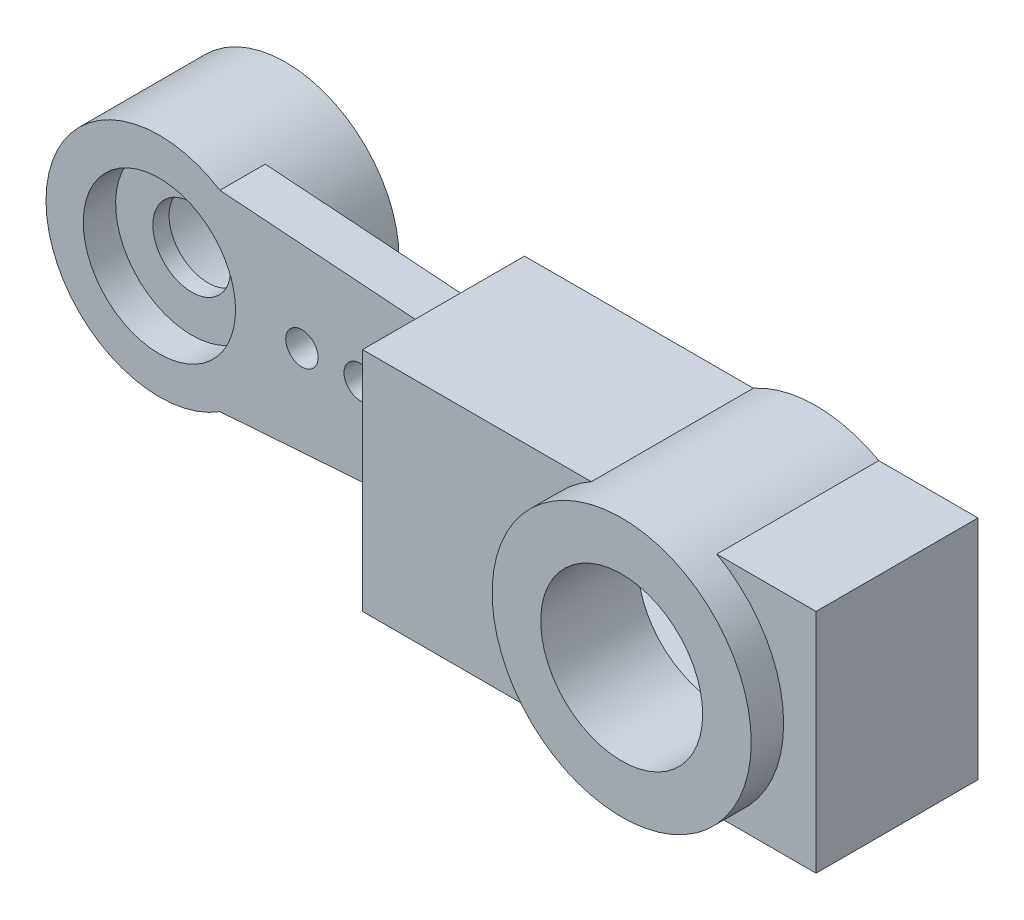
ISO-10303-21;
HEADER;
FILE_DESCRIPTION(('STEP AP214'),'2;1');
FILE_NAME('part.step','',(''),(''),'','','');
FILE_SCHEMA(('AUTOMOTIVE_DESIGN { 1 0 10303 214 1 1 1 1 }'));
ENDSEC;
DATA;
#1=APPLICATION_CONTEXT('core data for automotive mechanical design processes');
#2=APPLICATION_PROTOCOL_DEFINITION('international standard','automotive_design',2000,#1);
#3=PRODUCT_CONTEXT('',#1,'mechanical');
#4=PRODUCT('Part','Part','',(#3));
#5=PRODUCT_RELATED_PRODUCT_CATEGORY('part','',(#4));
#6=PRODUCT_DEFINITION_FORMATION('','',#4);
#7=PRODUCT_DEFINITION_CONTEXT('part definition',#1,'design');
#8=PRODUCT_DEFINITION('design','',#6,#7);
#9=PRODUCT_DEFINITION_SHAPE('','',#8);
#10=(LENGTH_UNIT() NAMED_UNIT(*) SI_UNIT(.MILLI.,.METRE.));
#11=(NAMED_UNIT(*) PLANE_ANGLE_UNIT() SI_UNIT($,.RADIAN.));
#12=(NAMED_UNIT(*) SI_UNIT($,.STERADIAN.) SOLID_ANGLE_UNIT());
#13=UNCERTAINTY_MEASURE_WITH_UNIT(LENGTH_MEASURE(1.E-05),#10,'distance_accuracy_value','');
#14=(GEOMETRIC_REPRESENTATION_CONTEXT(3) GLOBAL_UNCERTAINTY_ASSIGNED_CONTEXT((#13)) GLOBAL_UNIT_ASSIGNED_CONTEXT((#10,
#11,#12)) REPRESENTATION_CONTEXT('',''));
#15=CARTESIAN_POINT('',(0.,0.,0.));
#16=DIRECTION('',(0.,0.,1.));
#17=DIRECTION('',(1.,0.,0.));
#18=AXIS2_PLACEMENT_3D('',#15,#16,#17);
#19=CARTESIAN_POINT('',(13.5377556076663,7.66806747446083,7.8079032737814));
#20=DIRECTION('',(0.,0.,1.));
#21=DIRECTION('',(1.,0.,0.));
#22=AXIS2_PLACEMENT_3D('',#19,#20,#21);
#23=PLANE('',#22);
#24=DIRECTION('',(-1.,0.,0.));
#25=VECTOR('',#24,1.);
#26=CARTESIAN_POINT('',(13.5377556076663,5.16806747446083,7.8079032737814));
#27=LINE('',#26,#25);
#28=CARTESIAN_POINT('',(11.5377556076663,5.16806747446083,7.8079032737814));
#29=VERTEX_POINT('',#28);
#30=CARTESIAN_POINT('',(8.53775560766627,5.16806747446083,7.8079032737814));
#31=VERTEX_POINT('',#30);
#32=EDGE_CURVE('P0_E131',#29,#31,#27,.T.);
#33=ORIENTED_EDGE('',*,*,#32,.F.);
#34=DIRECTION('',(0.,1.,0.));
#35=VECTOR('',#34,1.);
#36=CARTESIAN_POINT('',(11.5377556076663,10.1680674744608,7.8079032737814));
#37=LINE('',#36,#35);
#38=CARTESIAN_POINT('',(11.5377556076663,10.1680674744608,7.8079032737814));
#39=VERTEX_POINT('',#38);
#40=EDGE_CURVE('P0_E130',#29,#39,#37,.T.);
#41=ORIENTED_EDGE('',*,*,#40,.T.);
#42=DIRECTION('',(-1.,0.,0.));
#43=VECTOR('',#42,1.);
#44=CARTESIAN_POINT('',(13.5377556076663,10.1680674744608,7.8079032737814));
#45=LINE('',#44,#43);
#46=CARTESIAN_POINT('',(8.53775560766627,10.1680674744608,7.8079032737814));
#47=VERTEX_POINT('',#46);
#48=EDGE_CURVE('P0_E117',#39,#47,#45,.T.);
#49=ORIENTED_EDGE('',*,*,#48,.T.);
#50=CARTESIAN_POINT('',(8.53775560766627,7.66806747446083,7.8079032737814));
#51=DIRECTION('',(0.,0.,-1.));
#52=DIRECTION('',(-1.,0.,0.));
#53=AXIS2_PLACEMENT_3D('',#50,#51,#52);
#54=CIRCLE('',#53,2.5);
#55=EDGE_CURVE('P0_E138',#31,#47,#54,.F.);
#56=ORIENTED_EDGE('',*,*,#55,.F.);
#57=EDGE_LOOP('',(#33,#41,#49,#56));
#58=FACE_BOUND('',#57,.T.);
#59=ADVANCED_FACE('P0_F17',(#58),#23,.T.);
#60=CARTESIAN_POINT('',(13.5377556076663,5.16806747446083,8.8079032737814));
#61=DIRECTION('',(0.,1.,0.));
#62=DIRECTION('',(0.,0.,1.));
#63=AXIS2_PLACEMENT_3D('',#60,#61,#62);
#64=PLANE('',#63);
#65=DIRECTION('',(-1.,0.,0.));
#66=VECTOR('',#65,1.);
#67=CARTESIAN_POINT('',(13.5377556076663,5.16806747446083,9.8079032737814));
#68=LINE('',#67,#66);
#69=CARTESIAN_POINT('',(11.5377556076663,5.16806747446083,9.8079032737814));
#70=VERTEX_POINT('',#69);
#71=CARTESIAN_POINT('',(8.53775560766627,5.16806747446083,9.8079032737814));
#72=VERTEX_POINT('',#71);
#73=EDGE_CURVE('P0_E218',#70,#72,#68,.T.);
#74=ORIENTED_EDGE('',*,*,#73,.F.);
#75=DIRECTION('',(0.,0.,-1.));
#76=VECTOR('',#75,1.);
#77=CARTESIAN_POINT('',(11.5377556076663,5.16806747446083,9.8079032737814));
#78=LINE('',#77,#76);
#79=EDGE_CURVE('P0_E31',#70,#29,#78,.T.);
#80=ORIENTED_EDGE('',*,*,#79,.T.);
#81=ORIENTED_EDGE('',*,*,#32,.T.);
#82=CARTESIAN_POINT('',(-0.46224439233373,5.16806747446083,7.8079032737814));
#83=VERTEX_POINT('',#82);
#84=EDGE_CURVE('P0_E220',#31,#83,#27,.T.);
#85=ORIENTED_EDGE('',*,*,#84,.T.);
#86=DIRECTION('',(0.,0.,-1.));
#87=VECTOR('',#86,1.);
#88=CARTESIAN_POINT('',(-0.46224439233373,5.16806747446083,8.8079032737814));
#89=LINE('',#88,#87);
#90=CARTESIAN_POINT('',(-0.46224439233373,5.16806747446083,9.8079032737814));
#91=VERTEX_POINT('',#90);
#92=EDGE_CURVE('P0_E179',#91,#83,#89,.T.);
#93=ORIENTED_EDGE('',*,*,#92,.F.);
#94=EDGE_CURVE('P0_E217',#72,#91,#68,.T.);
#95=ORIENTED_EDGE('',*,*,#94,.F.);
#96=EDGE_LOOP('',(#74,#80,#81,#85,#93,#95));
#97=FACE_BOUND('',#96,.T.);
#98=ADVANCED_FACE('P0_F275',(#97),#64,.T.);
#99=CARTESIAN_POINT('',(13.5377556076663,7.66806747446083,9.8079032737814));
#100=DIRECTION('',(0.,0.,1.));
#101=DIRECTION('',(1.,0.,0.));
#102=AXIS2_PLACEMENT_3D('',#99,#100,#101);
#103=PLANE('',#102);
#104=DIRECTION('',(0.,-1.,0.));
#105=VECTOR('',#104,1.);
#106=CARTESIAN_POINT('',(11.5377556076663,10.1680674744608,9.8079032737814));
#107=LINE('',#106,#105);
#108=CARTESIAN_POINT('',(11.5377556076663,10.1680674744608,9.8079032737814));
#109=VERTEX_POINT('',#108);
#110=EDGE_CURVE('P0_E39',#109,#70,#107,.T.);
#111=ORIENTED_EDGE('',*,*,#110,.T.);
#112=ORIENTED_EDGE('',*,*,#73,.T.);
#113=CARTESIAN_POINT('',(8.53775560766627,7.66806747446083,9.8079032737814));
#114=DIRECTION('',(0.,0.,1.));
#115=DIRECTION('',(1.,0.,0.));
#116=AXIS2_PLACEMENT_3D('',#113,#114,#115);
#117=CIRCLE('',#116,2.5);
#118=CARTESIAN_POINT('',(8.53775560766627,10.1680674744608,9.8079032737814));
#119=VERTEX_POINT('',#118);
#120=EDGE_CURVE('P0_E142',#119,#72,#117,.F.);
#121=ORIENTED_EDGE('',*,*,#120,.F.);
#122=DIRECTION('',(-1.,0.,0.));
#123=VECTOR('',#122,1.);
#124=CARTESIAN_POINT('',(13.5377556076663,10.1680674744608,9.8079032737814));
#125=LINE('',#124,#123);
#126=EDGE_CURVE('P0_E215',#109,#119,#125,.T.);
#127=ORIENTED_EDGE('',*,*,#126,.F.);
#128=EDGE_LOOP('',(#111,#112,#121,#127));
#129=FACE_BOUND('',#128,.T.);
#130=ADVANCED_FACE('P0_F280',(#129),#103,.F.);
#131=CARTESIAN_POINT('',(13.5377556076663,10.1680674744608,8.8079032737814));
#132=DIRECTION('',(0.,1.,0.));
#133=DIRECTION('',(0.,0.,1.));
#134=AXIS2_PLACEMENT_3D('',#131,#132,#133);
#135=PLANE('',#134);
#136=DIRECTION('',(0.,0.,1.));
#137=VECTOR('',#136,1.);
#138=CARTESIAN_POINT('',(11.5377556076663,10.1680674744608,9.8079032737814));
#139=LINE('',#138,#137);
#140=EDGE_CURVE('P0_E121',#39,#109,#139,.T.);
#141=ORIENTED_EDGE('',*,*,#140,.T.);
#142=ORIENTED_EDGE('',*,*,#126,.T.);
#143=CARTESIAN_POINT('',(-0.46224439233373,10.1680674744608,9.8079032737814));
#144=VERTEX_POINT('',#143);
#145=EDGE_CURVE('P0_E127',#119,#144,#125,.T.);
#146=ORIENTED_EDGE('',*,*,#145,.T.);
#147=DIRECTION('',(0.,0.,-1.));
#148=VECTOR('',#147,1.);
#149=CARTESIAN_POINT('',(-0.46224439233373,10.1680674744608,8.8079032737814));
#150=LINE('',#149,#148);
#151=CARTESIAN_POINT('',(-0.46224439233373,10.1680674744608,7.8079032737814));
#152=VERTEX_POINT('',#151);
#153=EDGE_CURVE('P0_E185',#144,#152,#150,.T.);
#154=ORIENTED_EDGE('',*,*,#153,.T.);
#155=EDGE_CURVE('P0_E123',#47,#152,#45,.T.);
#156=ORIENTED_EDGE('',*,*,#155,.F.);
#157=ORIENTED_EDGE('',*,*,#48,.F.);
#158=EDGE_LOOP('',(#141,#142,#146,#154,#156,#157));
#159=FACE_BOUND('',#158,.T.);
#160=ADVANCED_FACE('P0_F119',(#159),#135,.F.);
#161=CARTESIAN_POINT('',(8.53775560766627,7.66806747446083,-2.1920967262186));
#162=DIRECTION('',(0.,0.,1.));
#163=DIRECTION('',(1.,0.,0.));
#164=AXIS2_PLACEMENT_3D('',#161,#162,#163);
#165=CYLINDRICAL_SURFACE('',#164,2.5);
#166=EDGE_CURVE('P0_E135',#47,#31,#54,.F.);
#167=ORIENTED_EDGE('',*,*,#166,.T.);
#168=ORIENTED_EDGE('',*,*,#55,.T.);
#169=EDGE_LOOP('',(#167,#168));
#170=FACE_BOUND('',#169,.T.);
#171=CARTESIAN_POINT('',(8.53775560766627,7.66806747446083,7.3079032737814));
#172=DIRECTION('',(0.,0.,-1.));
#173=DIRECTION('',(-1.,0.,0.));
#174=AXIS2_PLACEMENT_3D('',#171,#172,#173);
#175=CIRCLE('',#174,2.5);
#176=CARTESIAN_POINT('',(6.03775560766627,7.66806747446083,7.3079032737814));
#177=VERTEX_POINT('',#176);
#178=EDGE_CURVE('P0_E11',#177,#177,#175,.F.);
#179=ORIENTED_EDGE('',*,*,#178,.F.);
#180=EDGE_LOOP('',(#179));
#181=FACE_BOUND('',#180,.T.);
#182=ADVANCED_FACE('P0_F295',(#170,#181),#165,.F.);
#183=CARTESIAN_POINT('',(8.53775560766627,7.66806747446083,12.8079032737814));
#184=DIRECTION('',(0.,0.,1.));
#185=DIRECTION('',(1.,0.,0.));
#186=AXIS2_PLACEMENT_3D('',#183,#184,#185);
#187=CIRCLE('',#186,2.5);
#188=CARTESIAN_POINT('',(11.0377556076663,7.66806747446083,12.8079032737814));
#189=VERTEX_POINT('',#188);
#190=EDGE_CURVE('P0_E146',#189,#189,#187,.T.);
#191=ORIENTED_EDGE('',*,*,#190,.T.);
#192=EDGE_LOOP('',(#191));
#193=FACE_BOUND('',#192,.T.);
#194=ORIENTED_EDGE('',*,*,#120,.T.);
#195=EDGE_CURVE('P0_E145',#72,#119,#117,.F.);
#196=ORIENTED_EDGE('',*,*,#195,.T.);
#197=EDGE_LOOP('',(#194,#196));
#198=FACE_BOUND('',#197,.T.);
#199=ADVANCED_FACE('P0_F298',(#193,#198),#165,.F.);
#200=CARTESIAN_POINT('',(13.5377556076663,4.16806747446083,8.8079032737814));
#201=DIRECTION('',(0.,1.,0.));
#202=DIRECTION('',(0.,0.,1.));
#203=AXIS2_PLACEMENT_3D('',#200,#201,#202);
#204=PLANE('',#203);
#205=DIRECTION('',(-1.,0.,0.));
#206=VECTOR('',#205,1.);
#207=CARTESIAN_POINT('',(13.5377556076663,4.16806747446083,6.8079032737814));
#208=LINE('',#207,#206);
#209=CARTESIAN_POINT('',(6.60126393456256,4.16806747446083,6.8079032737814));
#210=VERTEX_POINT('',#209);
#211=CARTESIAN_POINT('',(-0.46224439233373,4.16806747446083,6.8079032737814));
#212=VERTEX_POINT('',#211);
#213=EDGE_CURVE('P0_E210',#210,#212,#208,.T.);
#214=ORIENTED_EDGE('',*,*,#213,.F.);
#215=DIRECTION('',(0.,0.,1.));
#216=VECTOR('',#215,1.);
#217=CARTESIAN_POINT('',(6.60126393456256,4.16806747446083,6.8079032737814));
#218=LINE('',#217,#216);
#219=CARTESIAN_POINT('',(6.60126393456256,4.16806747446083,11.8079032737814));
#220=VERTEX_POINT('',#219);
#221=EDGE_CURVE('P0_E157',#210,#220,#218,.T.);
#222=ORIENTED_EDGE('',*,*,#221,.T.);
#223=DIRECTION('',(-1.,0.,0.));
#224=VECTOR('',#223,1.);
#225=CARTESIAN_POINT('',(13.5377556076663,4.16806747446083,11.8079032737814));
#226=LINE('',#225,#224);
#227=CARTESIAN_POINT('',(-0.46224439233373,4.16806747446083,11.8079032737814));
#228=VERTEX_POINT('',#227);
#229=EDGE_CURVE('P0_E202',#220,#228,#226,.T.);
#230=ORIENTED_EDGE('',*,*,#229,.T.);
#231=DIRECTION('',(0.,0.,-1.));
#232=VECTOR('',#231,1.);
#233=CARTESIAN_POINT('',(-0.46224439233373,4.16806747446083,8.8079032737814));
#234=LINE('',#233,#232);
#235=EDGE_CURVE('P0_E187',#228,#212,#234,.T.);
#236=ORIENTED_EDGE('',*,*,#235,.T.);
#237=EDGE_LOOP('',(#214,#222,#230,#236));
#238=FACE_BOUND('',#237,.T.);
#239=ADVANCED_FACE('P0_F255',(#238),#204,.F.);
#240=CARTESIAN_POINT('',(13.5377556076663,11.1680674744608,8.8079032737814));
#241=DIRECTION('',(0.,1.,0.));
#242=DIRECTION('',(0.,0.,1.));
#243=AXIS2_PLACEMENT_3D('',#240,#241,#242);
#244=PLANE('',#243);
#245=DIRECTION('',(0.,0.,1.));
#246=VECTOR('',#245,1.);
#247=CARTESIAN_POINT('',(6.60126393456256,11.1680674744608,6.8079032737814));
#248=LINE('',#247,#246);
#249=CARTESIAN_POINT('',(6.60126393456256,11.1680674744608,6.8079032737814));
#250=VERTEX_POINT('',#249);
#251=CARTESIAN_POINT('',(6.60126393456256,11.1680674744608,11.8079032737814));
#252=VERTEX_POINT('',#251);
#253=EDGE_CURVE('P0_E155',#250,#252,#248,.T.);
#254=ORIENTED_EDGE('',*,*,#253,.F.);
#255=DIRECTION('',(-1.,0.,0.));
#256=VECTOR('',#255,1.);
#257=CARTESIAN_POINT('',(13.5377556076663,11.1680674744608,6.8079032737814));
#258=LINE('',#257,#256);
#259=CARTESIAN_POINT('',(-0.46224439233373,11.1680674744608,6.8079032737814));
#260=VERTEX_POINT('',#259);
#261=EDGE_CURVE('P0_E206',#250,#260,#258,.T.);
#262=ORIENTED_EDGE('',*,*,#261,.T.);
#263=DIRECTION('',(0.,0.,-1.));
#264=VECTOR('',#263,1.);
#265=CARTESIAN_POINT('',(-0.46224439233373,11.1680674744608,8.8079032737814));
#266=LINE('',#265,#264);
#267=CARTESIAN_POINT('',(-0.46224439233373,11.1680674744608,11.8079032737814));
#268=VERTEX_POINT('',#267);
#269=EDGE_CURVE('P0_E193',#268,#260,#266,.T.);
#270=ORIENTED_EDGE('',*,*,#269,.F.);
#271=DIRECTION('',(-1.,0.,0.));
#272=VECTOR('',#271,1.);
#273=CARTESIAN_POINT('',(13.5377556076663,11.1680674744608,11.8079032737814));
#274=LINE('',#273,#272);
#275=EDGE_CURVE('P0_E201',#252,#268,#274,.T.);
#276=ORIENTED_EDGE('',*,*,#275,.F.);
#277=EDGE_LOOP('',(#254,#262,#270,#276));
#278=FACE_BOUND('',#277,.T.);
#279=ADVANCED_FACE('P0_F251',(#278),#244,.T.);
#280=CARTESIAN_POINT('',(13.5377556076663,7.66806747446083,11.8079032737814));
#281=DIRECTION('',(0.,0.,-1.));
#282=DIRECTION('',(0.,1.,0.));
#283=AXIS2_PLACEMENT_3D('',#280,#281,#282);
#284=PLANE('',#283);
#285=CARTESIAN_POINT('',(13.5377556076663,11.1680674744608,11.8079032737814));
#286=VERTEX_POINT('',#285);
#287=CARTESIAN_POINT('',(10.47424728077,11.1680674744608,11.8079032737814));
#288=VERTEX_POINT('',#287);
#289=EDGE_CURVE('P0_E203',#286,#288,#274,.T.);
#290=ORIENTED_EDGE('',*,*,#289,.T.);
#291=CARTESIAN_POINT('',(8.53775560766627,7.66806747446083,11.8079032737814));
#292=DIRECTION('',(0.,0.,-1.));
#293=DIRECTION('',(0.,1.,0.));
#294=AXIS2_PLACEMENT_3D('',#291,#292,#293);
#295=CIRCLE('',#294,4.);
#296=CARTESIAN_POINT('',(10.47424728077,4.16806747446083,11.8079032737814));
#297=VERTEX_POINT('',#296);
#298=EDGE_CURVE('P0_E24',#288,#297,#295,.T.);
#299=ORIENTED_EDGE('',*,*,#298,.T.);
#300=CARTESIAN_POINT('',(13.5377556076663,4.16806747446083,11.8079032737814));
#301=VERTEX_POINT('',#300);
#302=EDGE_CURVE('P0_E198',#301,#297,#226,.T.);
#303=ORIENTED_EDGE('',*,*,#302,.F.);
#304=DIRECTION('',(0.,-1.,0.));
#305=VECTOR('',#304,1.);
#306=CARTESIAN_POINT('',(13.5377556076663,7.66806747446083,11.8079032737814));
#307=LINE('',#306,#305);
#308=EDGE_CURVE('P0_E175',#286,#301,#307,.T.);
#309=ORIENTED_EDGE('',*,*,#308,.F.);
#310=EDGE_LOOP('',(#290,#299,#303,#309));
#311=FACE_BOUND('',#310,.T.);
#312=ADVANCED_FACE('P0_F228',(#311),#284,.F.);
#313=ORIENTED_EDGE('',*,*,#84,.F.);
#314=ORIENTED_EDGE('',*,*,#166,.F.);
#315=ORIENTED_EDGE('',*,*,#155,.T.);
#316=DIRECTION('',(0.,1.,0.));
#317=VECTOR('',#316,1.);
#318=CARTESIAN_POINT('',(-0.46224439233373,7.66806747446083,7.8079032737814));
#319=LINE('',#318,#317);
#320=EDGE_CURVE('P0_E165',#83,#152,#319,.T.);
#321=ORIENTED_EDGE('',*,*,#320,.F.);
#322=EDGE_LOOP('',(#313,#314,#315,#321));
#323=FACE_BOUND('',#322,.T.);
#324=ADVANCED_FACE('P0_F276',(#323),#23,.T.);
#325=ORIENTED_EDGE('',*,*,#145,.F.);
#326=ORIENTED_EDGE('',*,*,#195,.F.);
#327=ORIENTED_EDGE('',*,*,#94,.T.);
#328=DIRECTION('',(0.,1.,0.));
#329=VECTOR('',#328,1.);
#330=CARTESIAN_POINT('',(-0.46224439233373,7.66806747446083,9.8079032737814));
#331=LINE('',#330,#329);
#332=EDGE_CURVE('P0_E182',#91,#144,#331,.T.);
#333=ORIENTED_EDGE('',*,*,#332,.T.);
#334=EDGE_LOOP('',(#325,#326,#327,#333));
#335=FACE_BOUND('',#334,.T.);
#336=ADVANCED_FACE('P0_F282',(#335),#103,.F.);
#337=ORIENTED_EDGE('',*,*,#302,.T.);
#338=DIRECTION('',(0.,0.,1.));
#339=VECTOR('',#338,1.);
#340=CARTESIAN_POINT('',(10.47424728077,4.16806747446083,6.8079032737814));
#341=LINE('',#340,#339);
#342=CARTESIAN_POINT('',(10.47424728077,4.16806747446083,6.8079032737814));
#343=VERTEX_POINT('',#342);
#344=EDGE_CURVE('P0_E162',#297,#343,#341,.F.);
#345=ORIENTED_EDGE('',*,*,#344,.T.);
#346=CARTESIAN_POINT('',(13.5377556076663,4.16806747446083,6.8079032737814));
#347=VERTEX_POINT('',#346);
#348=EDGE_CURVE('P0_E211',#347,#343,#208,.T.);
#349=ORIENTED_EDGE('',*,*,#348,.F.);
#350=DIRECTION('',(0.,0.,-1.));
#351=VECTOR('',#350,1.);
#352=CARTESIAN_POINT('',(13.5377556076663,4.16806747446083,8.8079032737814));
#353=LINE('',#352,#351);
#354=EDGE_CURVE('P0_E166',#301,#347,#353,.T.);
#355=ORIENTED_EDGE('',*,*,#354,.F.);
#356=EDGE_LOOP('',(#337,#345,#349,#355));
#357=FACE_BOUND('',#356,.T.);
#358=ADVANCED_FACE('P0_F234',(#357),#204,.F.);
#359=CARTESIAN_POINT('',(13.5377556076663,7.66806747446083,6.8079032737814));
#360=DIRECTION('',(0.,0.,1.));
#361=DIRECTION('',(1.,0.,0.));
#362=AXIS2_PLACEMENT_3D('',#359,#360,#361);
#363=PLANE('',#362);
#364=ORIENTED_EDGE('',*,*,#348,.T.);
#365=CARTESIAN_POINT('',(8.53775560766627,7.66806747446083,6.8079032737814));
#366=DIRECTION('',(0.,0.,1.));
#367=DIRECTION('',(1.,0.,0.));
#368=AXIS2_PLACEMENT_3D('',#365,#366,#367);
#369=CIRCLE('',#368,4.);
#370=EDGE_CURVE('P0_E152',#210,#343,#369,.T.);
#371=ORIENTED_EDGE('',*,*,#370,.F.);
#372=ORIENTED_EDGE('',*,*,#213,.T.);
#373=DIRECTION('',(0.,1.,0.));
#374=VECTOR('',#373,1.);
#375=CARTESIAN_POINT('',(-0.46224439233373,7.66806747446083,6.8079032737814));
#376=LINE('',#375,#374);
#377=EDGE_CURVE('P0_E190',#212,#260,#376,.T.);
#378=ORIENTED_EDGE('',*,*,#377,.T.);
#379=ORIENTED_EDGE('',*,*,#261,.F.);
#380=CARTESIAN_POINT('',(10.47424728077,11.1680674744608,6.8079032737814));
#381=VERTEX_POINT('',#380);
#382=EDGE_CURVE('P0_E153',#381,#250,#369,.T.);
#383=ORIENTED_EDGE('',*,*,#382,.F.);
#384=CARTESIAN_POINT('',(13.5377556076663,11.1680674744608,6.8079032737814));
#385=VERTEX_POINT('',#384);
#386=EDGE_CURVE('P0_E207',#385,#381,#258,.T.);
#387=ORIENTED_EDGE('',*,*,#386,.F.);
#388=DIRECTION('',(0.,1.,0.));
#389=VECTOR('',#388,1.);
#390=CARTESIAN_POINT('',(13.5377556076663,7.66806747446083,6.8079032737814));
#391=LINE('',#390,#389);
#392=EDGE_CURVE('P0_E169',#347,#385,#391,.T.);
#393=ORIENTED_EDGE('',*,*,#392,.F.);
#394=EDGE_LOOP('',(#364,#371,#372,#378,#379,#383,#387,#393));
#395=FACE_BOUND('',#394,.T.);
#396=ADVANCED_FACE('P0_F247',(#395),#363,.F.);
#397=DIRECTION('',(0.,0.,1.));
#398=VECTOR('',#397,1.);
#399=CARTESIAN_POINT('',(10.47424728077,11.1680674744608,6.8079032737814));
#400=LINE('',#399,#398);
#401=EDGE_CURVE('P0_E160',#288,#381,#400,.F.);
#402=ORIENTED_EDGE('',*,*,#401,.F.);
#403=ORIENTED_EDGE('',*,*,#289,.F.);
#404=DIRECTION('',(0.,0.,-1.));
#405=VECTOR('',#404,1.);
#406=CARTESIAN_POINT('',(13.5377556076663,11.1680674744608,8.8079032737814));
#407=LINE('',#406,#405);
#408=EDGE_CURVE('P0_E172',#286,#385,#407,.T.);
#409=ORIENTED_EDGE('',*,*,#408,.T.);
#410=ORIENTED_EDGE('',*,*,#386,.T.);
#411=EDGE_LOOP('',(#402,#403,#409,#410));
#412=FACE_BOUND('',#411,.T.);
#413=ADVANCED_FACE('P0_F241',(#412),#244,.T.);
#414=ORIENTED_EDGE('',*,*,#229,.F.);
#415=EDGE_CURVE('P0_E213',#220,#252,#295,.T.);
#416=ORIENTED_EDGE('',*,*,#415,.T.);
#417=ORIENTED_EDGE('',*,*,#275,.T.);
#418=DIRECTION('',(0.,-1.,0.));
#419=VECTOR('',#418,1.);
#420=CARTESIAN_POINT('',(-0.46224439233373,7.66806747446083,11.8079032737814));
#421=LINE('',#420,#419);
#422=EDGE_CURVE('P0_E170',#268,#228,#421,.T.);
#423=ORIENTED_EDGE('',*,*,#422,.T.);
#424=EDGE_LOOP('',(#414,#416,#417,#423));
#425=FACE_BOUND('',#424,.T.);
#426=ADVANCED_FACE('P0_F256',(#425),#284,.F.);
#427=CARTESIAN_POINT('',(13.5377556076663,7.66806747446083,8.8079032737814));
#428=DIRECTION('',(1.,0.,0.));
#429=DIRECTION('',(0.,0.,-1.));
#430=AXIS2_PLACEMENT_3D('',#427,#428,#429);
#431=PLANE('',#430);
#432=ORIENTED_EDGE('',*,*,#354,.T.);
#433=ORIENTED_EDGE('',*,*,#392,.T.);
#434=ORIENTED_EDGE('',*,*,#408,.F.);
#435=ORIENTED_EDGE('',*,*,#308,.T.);
#436=EDGE_LOOP('',(#432,#433,#434,#435));
#437=FACE_BOUND('',#436,.T.);
#438=ADVANCED_FACE('P0_F237',(#437),#431,.T.);
#439=CARTESIAN_POINT('',(-0.46224439233373,7.66806747446083,8.8079032737814));
#440=DIRECTION('',(1.,0.,0.));
#441=DIRECTION('',(0.,0.,-1.));
#442=AXIS2_PLACEMENT_3D('',#439,#440,#441);
#443=PLANE('',#442);
#444=ORIENTED_EDGE('',*,*,#320,.T.);
#445=ORIENTED_EDGE('',*,*,#153,.F.);
#446=ORIENTED_EDGE('',*,*,#332,.F.);
#447=ORIENTED_EDGE('',*,*,#92,.T.);
#448=EDGE_LOOP('',(#444,#445,#446,#447));
#449=FACE_BOUND('',#448,.T.);
#450=ORIENTED_EDGE('',*,*,#235,.F.);
#451=ORIENTED_EDGE('',*,*,#422,.F.);
#452=ORIENTED_EDGE('',*,*,#269,.T.);
#453=ORIENTED_EDGE('',*,*,#377,.F.);
#454=EDGE_LOOP('',(#450,#451,#452,#453));
#455=FACE_BOUND('',#454,.T.);
#456=ADVANCED_FACE('P0_F260',(#449,#455),#443,.F.);
#457=CARTESIAN_POINT('',(8.53775560766627,7.66806747446083,12.8079032737814));
#458=DIRECTION('',(0.,0.,1.));
#459=DIRECTION('',(1.,0.,0.));
#460=AXIS2_PLACEMENT_3D('',#457,#458,#459);
#461=PLANE('',#460);
#462=CARTESIAN_POINT('',(8.53775560766627,7.66806747446083,12.8079032737814));
#463=DIRECTION('',(0.,0.,1.));
#464=DIRECTION('',(1.,0.,0.));
#465=AXIS2_PLACEMENT_3D('',#462,#463,#464);
#466=CIRCLE('',#465,4.);
#467=CARTESIAN_POINT('',(12.5377556076663,7.66806747446083,12.8079032737814));
#468=VERTEX_POINT('',#467);
#469=EDGE_CURVE('P0_E149',#468,#468,#466,.T.);
#470=ORIENTED_EDGE('',*,*,#469,.T.);
#471=EDGE_LOOP('',(#470));
#472=FACE_BOUND('',#471,.T.);
#473=ORIENTED_EDGE('',*,*,#190,.F.);
#474=EDGE_LOOP('',(#473));
#475=FACE_BOUND('',#474,.T.);
#476=ADVANCED_FACE('P0_F262',(#472,#475),#461,.T.);
#477=CARTESIAN_POINT('',(8.53775560766627,7.66806747446083,6.8079032737814));
#478=DIRECTION('',(0.,0.,1.));
#479=DIRECTION('',(1.,0.,0.));
#480=AXIS2_PLACEMENT_3D('',#477,#478,#479);
#481=CYLINDRICAL_SURFACE('',#480,4.);
#482=ORIENTED_EDGE('',*,*,#469,.F.);
#483=EDGE_LOOP('',(#482));
#484=FACE_BOUND('',#483,.T.);
#485=ORIENTED_EDGE('',*,*,#344,.F.);
#486=ORIENTED_EDGE('',*,*,#298,.F.);
#487=ORIENTED_EDGE('',*,*,#401,.T.);
#488=ORIENTED_EDGE('',*,*,#382,.T.);
#489=ORIENTED_EDGE('',*,*,#253,.T.);
#490=ORIENTED_EDGE('',*,*,#415,.F.);
#491=ORIENTED_EDGE('',*,*,#221,.F.);
#492=ORIENTED_EDGE('',*,*,#370,.T.);
#493=EDGE_LOOP('',(#485,#486,#487,#488,#489,#490,#491,#492));
#494=FACE_BOUND('',#493,.T.);
#495=ADVANCED_FACE('P0_F243',(#484,#494),#481,.T.);
#496=CARTESIAN_POINT('',(-0.46224439233373,7.66806747446083,7.3079032737814));
#497=DIRECTION('',(0.,0.,-1.));
#498=DIRECTION('',(-1.,0.,0.));
#499=AXIS2_PLACEMENT_3D('',#496,#497,#498);
#500=PLANE('',#499);
#501=ORIENTED_EDGE('',*,*,#178,.T.);
#502=EDGE_LOOP('',(#501));
#503=FACE_BOUND('',#502,.T.);
#504=ADVANCED_FACE('P0_F302',(#503),#500,.F.);
#505=CARTESIAN_POINT('',(11.5377556076663,7.66806747446083,8.8079032737814));
#506=DIRECTION('',(1.,0.,0.));
#507=DIRECTION('',(0.,0.,-1.));
#508=AXIS2_PLACEMENT_3D('',#505,#506,#507);
#509=PLANE('',#508);
#510=ORIENTED_EDGE('',*,*,#110,.F.);
#511=ORIENTED_EDGE('',*,*,#140,.F.);
#512=ORIENTED_EDGE('',*,*,#40,.F.);
#513=ORIENTED_EDGE('',*,*,#79,.F.);
#514=EDGE_LOOP('',(#510,#511,#512,#513));
#515=FACE_BOUND('',#514,.T.);
#516=ADVANCED_FACE('P0_F134',(#515),#509,.F.);
#517=CLOSED_SHELL('',(#59,#98,#130,#160,#182,#199,#239,#279,#312,#324,#336,#358,#396,#413,#426,
#438,#456,#476,#495,#504,#516));
#518=MANIFOLD_SOLID_BREP('P0_B1',#517);
#519=CARTESIAN_POINT('',(-24.5352023489862,7.66576538823056,7.80790327378148));
#520=DIRECTION('',(0.,0.,-1.));
#521=DIRECTION('',(0.,1.,0.));
#522=AXIS2_PLACEMENT_3D('',#519,#520,#521);
#523=PLANE('',#522);
#524=CARTESIAN_POINT('',(-3.13520234898618,7.66576538823062,7.80790327378148));
#525=DIRECTION('',(0.,0.,-1.));
#526=DIRECTION('',(0.,1.,0.));
#527=AXIS2_PLACEMENT_3D('',#524,#525,#526);
#528=CIRCLE('',#527,0.499999999999997);
#529=CARTESIAN_POINT('',(-3.13520234898618,8.16576538823062,7.80790327378149));
#530=VERTEX_POINT('',#529);
#531=EDGE_CURVE('P1_E112',#530,#530,#528,.T.);
#532=ORIENTED_EDGE('',*,*,#531,.F.);
#533=EDGE_LOOP('',(#532));
#534=FACE_BOUND('',#533,.T.);
#535=CARTESIAN_POINT('',(0.464797651013824,7.66576538823059,7.80790327378148));
#536=DIRECTION('',(0.,0.,-1.));
#537=DIRECTION('',(0.,1.,0.));
#538=AXIS2_PLACEMENT_3D('',#535,#536,#537);
#539=CIRCLE('',#538,0.499999999999997);
#540=CARTESIAN_POINT('',(0.464797651013824,8.16576538823059,7.80790327378149));
#541=VERTEX_POINT('',#540);
#542=EDGE_CURVE('P1_E124',#541,#541,#539,.T.);
#543=ORIENTED_EDGE('',*,*,#542,.F.);
#544=EDGE_LOOP('',(#543));
#545=FACE_BOUND('',#544,.T.);
#546=CARTESIAN_POINT('',(-1.33520234898618,7.66576538823061,7.80790327378148));
#547=DIRECTION('',(0.,0.,-1.));
#548=DIRECTION('',(0.,1.,0.));
#549=AXIS2_PLACEMENT_3D('',#546,#547,#548);
#550=CIRCLE('',#549,0.499999999999997);
#551=CARTESIAN_POINT('',(-1.33520234898618,8.16576538823061,7.80790327378149));
#552=VERTEX_POINT('',#551);
#553=EDGE_CURVE('P1_E118',#552,#552,#550,.T.);
#554=ORIENTED_EDGE('',*,*,#553,.F.);
#555=EDGE_LOOP('',(#554));
#556=FACE_BOUND('',#555,.T.);
#557=CARTESIAN_POINT('',(-4.93520234898618,7.66576538823063,7.80790327378148));
#558=DIRECTION('',(0.,0.,-1.));
#559=DIRECTION('',(0.,1.,0.));
#560=AXIS2_PLACEMENT_3D('',#557,#558,#559);
#561=CIRCLE('',#560,0.499999999999997);
#562=CARTESIAN_POINT('',(-4.93520234898618,8.16576538823063,7.80790327378149));
#563=VERTEX_POINT('',#562);
#564=EDGE_CURVE('P1_E106',#563,#563,#561,.T.);
#565=ORIENTED_EDGE('',*,*,#564,.F.);
#566=EDGE_LOOP('',(#565));
#567=FACE_BOUND('',#566,.T.);
#568=CARTESIAN_POINT('',(-9.33520234898617,7.66576538823056,7.80790327378148));
#569=DIRECTION('',(0.,0.,-1.));
#570=DIRECTION('',(0.,1.,0.));
#571=AXIS2_PLACEMENT_3D('',#568,#569,#570);
#572=CIRCLE('',#571,3.5);
#573=CARTESIAN_POINT('',(-7.46661763608723,10.6252233066204,7.80790327378151));
#574=VERTEX_POINT('',#573);
#575=CARTESIAN_POINT('',(-7.46661763608723,4.70630746984072,7.80790327378145));
#576=VERTEX_POINT('',#575);
#577=EDGE_CURVE('P1_E70',#574,#576,#572,.T.);
#578=ORIENTED_EDGE('',*,*,#577,.F.);
#579=DIRECTION('',(0.997420198870011,-0.0717840294641297,0.));
#580=VECTOR('',#579,1.);
#581=CARTESIAN_POINT('',(-24.2353550817609,11.83206425915,7.80790327378153));
#582=LINE('',#581,#580);
#583=CARTESIAN_POINT('',(1.66971457389267,9.96768424605368,7.80790327378151));
#584=VERTEX_POINT('',#583);
#585=EDGE_CURVE('P1_E86',#574,#584,#582,.T.);
#586=ORIENTED_EDGE('',*,*,#585,.T.);
#587=DIRECTION('',(0.,-1.,0.));
#588=VECTOR('',#587,1.);
#589=CARTESIAN_POINT('',(1.66971457389267,5.18905140219407,7.80790327378146));
#590=LINE('',#589,#588);
#591=CARTESIAN_POINT('',(1.66971457389267,5.36384653040745,7.80790327378146));
#592=VERTEX_POINT('',#591);
#593=EDGE_CURVE('P1_E24',#584,#592,#590,.T.);
#594=ORIENTED_EDGE('',*,*,#593,.T.);
#595=DIRECTION('',(-0.997420198870011,-0.0717840294641295,0.));
#596=VECTOR('',#595,1.);
#597=CARTESIAN_POINT('',(-24.2353550817609,3.49946651731117,7.80790327378144));
#598=LINE('',#597,#596);
#599=EDGE_CURVE('P1_E83',#592,#576,#598,.T.);
#600=ORIENTED_EDGE('',*,*,#599,.T.);
#601=EDGE_LOOP('',(#578,#586,#594,#600));
#602=FACE_BOUND('',#601,.T.);
#603=ADVANCED_FACE('P1_F16',(#534,#545,#556,#567,#602),#523,.T.);
#604=CARTESIAN_POINT('',(-24.5352023489862,7.66576538823055,9.20790327378148));
#605=DIRECTION('',(0.,0.,-1.));
#606=DIRECTION('',(0.,1.,0.));
#607=AXIS2_PLACEMENT_3D('',#604,#605,#606);
#608=PLANE('',#607);
#609=CARTESIAN_POINT('',(-9.33520234898617,7.66576538823055,9.20790327378148));
#610=DIRECTION('',(0.,0.,1.));
#611=DIRECTION('',(0.,-1.,0.));
#612=AXIS2_PLACEMENT_3D('',#609,#610,#611);
#613=CIRCLE('',#612,2.35);
#614=CARTESIAN_POINT('',(-9.33520234898617,5.31576538823055,9.20790327378146));
#615=VERTEX_POINT('',#614);
#616=EDGE_CURVE('P1_E98',#615,#615,#613,.T.);
#617=ORIENTED_EDGE('',*,*,#616,.F.);
#618=EDGE_LOOP('',(#617));
#619=FACE_BOUND('',#618,.T.);
#620=CARTESIAN_POINT('',(0.464797651013824,7.66576538823058,9.20790327378148));
#621=DIRECTION('',(0.,0.,-1.));
#622=DIRECTION('',(0.,1.,0.));
#623=AXIS2_PLACEMENT_3D('',#620,#621,#622);
#624=CIRCLE('',#623,0.499999999999997);
#625=CARTESIAN_POINT('',(0.464797651013824,8.16576538823058,9.20790327378149));
#626=VERTEX_POINT('',#625);
#627=EDGE_CURVE('P1_E121',#626,#626,#624,.T.);
#628=ORIENTED_EDGE('',*,*,#627,.T.);
#629=EDGE_LOOP('',(#628));
#630=FACE_BOUND('',#629,.T.);
#631=CARTESIAN_POINT('',(-1.33520234898618,7.66576538823059,9.20790327378148));
#632=DIRECTION('',(0.,0.,-1.));
#633=DIRECTION('',(0.,1.,0.));
#634=AXIS2_PLACEMENT_3D('',#631,#632,#633);
#635=CIRCLE('',#634,0.499999999999997);
#636=CARTESIAN_POINT('',(-1.33520234898618,8.16576538823059,9.20790327378149));
#637=VERTEX_POINT('',#636);
#638=EDGE_CURVE('P1_E115',#637,#637,#635,.T.);
#639=ORIENTED_EDGE('',*,*,#638,.T.);
#640=EDGE_LOOP('',(#639));
#641=FACE_BOUND('',#640,.T.);
#642=CARTESIAN_POINT('',(-3.13520234898618,7.66576538823061,9.20790327378148));
#643=DIRECTION('',(0.,0.,-1.));
#644=DIRECTION('',(0.,1.,0.));
#645=AXIS2_PLACEMENT_3D('',#642,#643,#644);
#646=CIRCLE('',#645,0.499999999999997);
#647=CARTESIAN_POINT('',(-3.13520234898618,8.1657653882306,9.20790327378149));
#648=VERTEX_POINT('',#647);
#649=EDGE_CURVE('P1_E109',#648,#648,#646,.T.);
#650=ORIENTED_EDGE('',*,*,#649,.T.);
#651=EDGE_LOOP('',(#650));
#652=FACE_BOUND('',#651,.T.);
#653=CARTESIAN_POINT('',(-4.93520234898618,7.66576538823062,9.20790327378148));
#654=DIRECTION('',(0.,0.,-1.));
#655=DIRECTION('',(0.,1.,0.));
#656=AXIS2_PLACEMENT_3D('',#653,#654,#655);
#657=CIRCLE('',#656,0.499999999999997);
#658=CARTESIAN_POINT('',(-4.93520234898618,8.16576538823062,9.20790327378149));
#659=VERTEX_POINT('',#658);
#660=EDGE_CURVE('P1_E103',#659,#659,#657,.T.);
#661=ORIENTED_EDGE('',*,*,#660,.T.);
#662=EDGE_LOOP('',(#661));
#663=FACE_BOUND('',#662,.T.);
#664=CARTESIAN_POINT('',(-9.33520234898617,7.66576538823055,9.20790327378148));
#665=DIRECTION('',(0.,0.,1.));
#666=DIRECTION('',(0.,-1.,0.));
#667=AXIS2_PLACEMENT_3D('',#664,#665,#666);
#668=CIRCLE('',#667,3.5);
#669=CARTESIAN_POINT('',(-7.46661763608723,10.6252233066204,9.20790327378151));
#670=VERTEX_POINT('',#669);
#671=CARTESIAN_POINT('',(-7.46661763608723,4.7063074698407,9.20790327378145));
#672=VERTEX_POINT('',#671);
#673=EDGE_CURVE('P1_E55',#670,#672,#668,.T.);
#674=ORIENTED_EDGE('',*,*,#673,.T.);
#675=DIRECTION('',(0.997420198870011,0.0717840294641295,0.));
#676=VECTOR('',#675,1.);
#677=CARTESIAN_POINT('',(-7.46661763608723,4.7063074698407,9.20790327378145));
#678=LINE('',#677,#676);
#679=CARTESIAN_POINT('',(1.66971457389268,5.36384653040744,9.20790327378146));
#680=VERTEX_POINT('',#679);
#681=EDGE_CURVE('P1_E60',#672,#680,#678,.T.);
#682=ORIENTED_EDGE('',*,*,#681,.T.);
#683=DIRECTION('',(0.,-1.,0.));
#684=VECTOR('',#683,1.);
#685=CARTESIAN_POINT('',(1.66971457389267,5.18905140219405,9.20790327378146));
#686=LINE('',#685,#684);
#687=CARTESIAN_POINT('',(1.66971457389267,9.96768424605366,9.20790327378151));
#688=VERTEX_POINT('',#687);
#689=EDGE_CURVE('P1_E127',#688,#680,#686,.T.);
#690=ORIENTED_EDGE('',*,*,#689,.F.);
#691=DIRECTION('',(-0.997420198870011,0.0717840294641296,0.));
#692=VECTOR('',#691,1.);
#693=CARTESIAN_POINT('',(5.86479765101383,9.66576538823055,9.2079032737815));
#694=LINE('',#693,#692);
#695=EDGE_CURVE('P1_E31',#688,#670,#694,.T.);
#696=ORIENTED_EDGE('',*,*,#695,.T.);
#697=EDGE_LOOP('',(#674,#682,#690,#696));
#698=FACE_BOUND('',#697,.T.);
#699=ADVANCED_FACE('P1_F57',(#619,#630,#641,#652,#663,#698),#608,.F.);
#700=CARTESIAN_POINT('',(1.66971457389267,5.18905140219407,7.80790327378146));
#701=DIRECTION('',(-1.,0.,0.));
#702=DIRECTION('',(0.,1.,0.));
#703=AXIS2_PLACEMENT_3D('',#700,#701,#702);
#704=PLANE('',#703);
#705=DIRECTION('',(0.,0.,-1.));
#706=VECTOR('',#705,1.);
#707=CARTESIAN_POINT('',(1.66971457389267,9.96768424605368,7.80790327378151));
#708=LINE('',#707,#706);
#709=EDGE_CURVE('P1_E35',#688,#584,#708,.T.);
#710=ORIENTED_EDGE('',*,*,#709,.F.);
#711=ORIENTED_EDGE('',*,*,#689,.T.);
#712=DIRECTION('',(0.,0.,1.));
#713=VECTOR('',#712,1.);
#714=CARTESIAN_POINT('',(1.66971457389267,5.36384653040745,7.80790327378146));
#715=LINE('',#714,#713);
#716=EDGE_CURVE('P1_E77',#592,#680,#715,.T.);
#717=ORIENTED_EDGE('',*,*,#716,.F.);
#718=ORIENTED_EDGE('',*,*,#593,.F.);
#719=EDGE_LOOP('',(#710,#711,#717,#718));
#720=FACE_BOUND('',#719,.T.);
#721=ADVANCED_FACE('P1_F18',(#720),#704,.F.);
#722=CARTESIAN_POINT('',(0.464797651013824,7.66576538823059,7.80790327378148));
#723=DIRECTION('',(0.,0.,1.));
#724=DIRECTION('',(0.,-1.,0.));
#725=AXIS2_PLACEMENT_3D('',#722,#723,#724);
#726=CYLINDRICAL_SURFACE('',#725,0.499999999999997);
#727=ORIENTED_EDGE('',*,*,#542,.T.);
#728=EDGE_LOOP('',(#727));
#729=FACE_BOUND('',#728,.T.);
#730=ORIENTED_EDGE('',*,*,#627,.F.);
#731=EDGE_LOOP('',(#730));
#732=FACE_BOUND('',#731,.T.);
#733=ADVANCED_FACE('P1_F181',(#729,#732),#726,.F.);
#734=CARTESIAN_POINT('',(-1.33520234898618,7.66576538823061,7.80790327378148));
#735=DIRECTION('',(0.,0.,1.));
#736=DIRECTION('',(0.,-1.,0.));
#737=AXIS2_PLACEMENT_3D('',#734,#735,#736);
#738=CYLINDRICAL_SURFACE('',#737,0.499999999999997);
#739=ORIENTED_EDGE('',*,*,#553,.T.);
#740=EDGE_LOOP('',(#739));
#741=FACE_BOUND('',#740,.T.);
#742=ORIENTED_EDGE('',*,*,#638,.F.);
#743=EDGE_LOOP('',(#742));
#744=FACE_BOUND('',#743,.T.);
#745=ADVANCED_FACE('P1_F170',(#741,#744),#738,.F.);
#746=CARTESIAN_POINT('',(-3.13520234898618,7.66576538823062,7.80790327378148));
#747=DIRECTION('',(0.,0.,1.));
#748=DIRECTION('',(0.,-1.,0.));
#749=AXIS2_PLACEMENT_3D('',#746,#747,#748);
#750=CYLINDRICAL_SURFACE('',#749,0.499999999999997);
#751=ORIENTED_EDGE('',*,*,#531,.T.);
#752=EDGE_LOOP('',(#751));
#753=FACE_BOUND('',#752,.T.);
#754=ORIENTED_EDGE('',*,*,#649,.F.);
#755=EDGE_LOOP('',(#754));
#756=FACE_BOUND('',#755,.T.);
#757=ADVANCED_FACE('P1_F163',(#753,#756),#750,.F.);
#758=CARTESIAN_POINT('',(-4.93520234898618,7.66576538823063,7.80790327378148));
#759=DIRECTION('',(0.,0.,1.));
#760=DIRECTION('',(0.,-1.,0.));
#761=AXIS2_PLACEMENT_3D('',#758,#759,#760);
#762=CYLINDRICAL_SURFACE('',#761,0.499999999999997);
#763=ORIENTED_EDGE('',*,*,#564,.T.);
#764=EDGE_LOOP('',(#763));
#765=FACE_BOUND('',#764,.T.);
#766=ORIENTED_EDGE('',*,*,#660,.F.);
#767=EDGE_LOOP('',(#766));
#768=FACE_BOUND('',#767,.T.);
#769=ADVANCED_FACE('P1_F148',(#765,#768),#762,.F.);
#770=CARTESIAN_POINT('',(-9.33520234898617,7.66576538823056,8.20790327378148));
#771=DIRECTION('',(0.,0.,1.));
#772=DIRECTION('',(0.,-1.,0.));
#773=AXIS2_PLACEMENT_3D('',#770,#771,#772);
#774=CYLINDRICAL_SURFACE('',#773,2.35);
#775=CARTESIAN_POINT('',(-9.33520234898617,7.66576538823056,8.20790327378148));
#776=DIRECTION('',(0.,0.,1.));
#777=DIRECTION('',(0.,-1.,0.));
#778=AXIS2_PLACEMENT_3D('',#775,#776,#777);
#779=CIRCLE('',#778,2.35);
#780=CARTESIAN_POINT('',(-9.33520234898617,5.31576538823056,8.20790327378146));
#781=VERTEX_POINT('',#780);
#782=EDGE_CURVE('P1_E100',#781,#781,#779,.T.);
#783=ORIENTED_EDGE('',*,*,#782,.F.);
#784=EDGE_LOOP('',(#783));
#785=FACE_BOUND('',#784,.T.);
#786=ORIENTED_EDGE('',*,*,#616,.T.);
#787=EDGE_LOOP('',(#786));
#788=FACE_BOUND('',#787,.T.);
#789=ADVANCED_FACE('P1_F142',(#785,#788),#774,.F.);
#790=CARTESIAN_POINT('',(-9.33520234898617,7.66576538823056,8.20790327378148));
#791=DIRECTION('',(0.,0.,1.));
#792=DIRECTION('',(0.,-1.,0.));
#793=AXIS2_PLACEMENT_3D('',#790,#791,#792);
#794=PLANE('',#793);
#795=CARTESIAN_POINT('',(-9.33520234898617,7.66576538823056,8.20790327378148));
#796=DIRECTION('',(0.,0.,1.));
#797=DIRECTION('',(0.,-1.,0.));
#798=AXIS2_PLACEMENT_3D('',#795,#796,#797);
#799=CIRCLE('',#798,1.2);
#800=CARTESIAN_POINT('',(-9.33520234898617,6.46576538823056,8.20790327378147));
#801=VERTEX_POINT('',#800);
#802=EDGE_CURVE('P1_E91',#801,#801,#799,.T.);
#803=ORIENTED_EDGE('',*,*,#802,.F.);
#804=EDGE_LOOP('',(#803));
#805=FACE_BOUND('',#804,.T.);
#806=ORIENTED_EDGE('',*,*,#782,.T.);
#807=EDGE_LOOP('',(#806));
#808=FACE_BOUND('',#807,.T.);
#809=ADVANCED_FACE('P1_F138',(#805,#808),#794,.T.);
#810=CARTESIAN_POINT('',(-9.33520234898617,7.66576538823059,5.30790327378148));
#811=DIRECTION('',(0.,0.,-1.));
#812=DIRECTION('',(0.,1.,0.));
#813=AXIS2_PLACEMENT_3D('',#810,#811,#812);
#814=PLANE('',#813);
#815=CARTESIAN_POINT('',(-9.33520234898617,7.66576538823059,5.30790327378148));
#816=DIRECTION('',(0.,0.,-1.));
#817=DIRECTION('',(0.,1.,0.));
#818=AXIS2_PLACEMENT_3D('',#815,#816,#817);
#819=CIRCLE('',#818,3.5);
#820=CARTESIAN_POINT('',(-9.33520234898617,11.1657653882306,5.30790327378152));
#821=VERTEX_POINT('',#820);
#822=EDGE_CURVE('P1_E95',#821,#821,#819,.T.);
#823=ORIENTED_EDGE('',*,*,#822,.T.);
#824=EDGE_LOOP('',(#823));
#825=FACE_BOUND('',#824,.T.);
#826=CARTESIAN_POINT('',(-9.33520234898617,7.66576538823059,5.30790327378148));
#827=DIRECTION('',(0.,0.,-1.));
#828=DIRECTION('',(0.,1.,0.));
#829=AXIS2_PLACEMENT_3D('',#826,#827,#828);
#830=CIRCLE('',#829,2.45);
#831=CARTESIAN_POINT('',(-9.33520234898617,10.1157653882306,5.30790327378151));
#832=VERTEX_POINT('',#831);
#833=EDGE_CURVE('P1_E92',#832,#832,#830,.T.);
#834=ORIENTED_EDGE('',*,*,#833,.F.);
#835=EDGE_LOOP('',(#834));
#836=FACE_BOUND('',#835,.T.);
#837=ADVANCED_FACE('P1_F141',(#825,#836),#814,.T.);
#838=CARTESIAN_POINT('',(-9.33520234898617,7.66576538823059,5.30790327378148));
#839=DIRECTION('',(0.,0.,1.));
#840=DIRECTION('',(0.,-1.,0.));
#841=AXIS2_PLACEMENT_3D('',#838,#839,#840);
#842=CYLINDRICAL_SURFACE('',#841,3.5);
#843=DIRECTION('',(0.,0.,1.));
#844=VECTOR('',#843,1.);
#845=CARTESIAN_POINT('',(-7.46661763608723,4.70630746984074,5.30790327378145));
#846=LINE('',#845,#844);
#847=EDGE_CURVE('P1_E64',#576,#672,#846,.T.);
#848=ORIENTED_EDGE('',*,*,#847,.T.);
#849=ORIENTED_EDGE('',*,*,#673,.F.);
#850=DIRECTION('',(0.,0.,1.));
#851=VECTOR('',#850,1.);
#852=CARTESIAN_POINT('',(-7.46661763608723,10.6252233066204,5.30790327378151));
#853=LINE('',#852,#851);
#854=EDGE_CURVE('P1_E73',#574,#670,#853,.T.);
#855=ORIENTED_EDGE('',*,*,#854,.F.);
#856=ORIENTED_EDGE('',*,*,#577,.T.);
#857=EDGE_LOOP('',(#848,#849,#855,#856));
#858=FACE_BOUND('',#857,.T.);
#859=ORIENTED_EDGE('',*,*,#822,.F.);
#860=EDGE_LOOP('',(#859));
#861=FACE_BOUND('',#860,.T.);
#862=ADVANCED_FACE('P1_F67',(#858,#861),#842,.T.);
#863=CARTESIAN_POINT('',(-9.33520234898617,7.66576538823059,5.30790327378148));
#864=DIRECTION('',(0.,0.,1.));
#865=DIRECTION('',(0.,-1.,0.));
#866=AXIS2_PLACEMENT_3D('',#863,#864,#865);
#867=CYLINDRICAL_SURFACE('',#866,2.45);
#868=CARTESIAN_POINT('',(-9.33520234898617,7.66576538823057,7.70790327378148));
#869=DIRECTION('',(0.,0.,-1.));
#870=DIRECTION('',(0.,1.,0.));
#871=AXIS2_PLACEMENT_3D('',#868,#869,#870);
#872=CIRCLE('',#871,2.45);
#873=CARTESIAN_POINT('',(-9.33520234898617,10.1157653882306,7.70790327378151));
#874=VERTEX_POINT('',#873);
#875=EDGE_CURVE('P1_E10',#874,#874,#872,.T.);
#876=ORIENTED_EDGE('',*,*,#875,.F.);
#877=EDGE_LOOP('',(#876));
#878=FACE_BOUND('',#877,.T.);
#879=ORIENTED_EDGE('',*,*,#833,.T.);
#880=EDGE_LOOP('',(#879));
#881=FACE_BOUND('',#880,.T.);
#882=ADVANCED_FACE('P1_F255',(#878,#881),#867,.F.);
#883=CARTESIAN_POINT('',(-9.33520234898617,7.66576538823055,9.20790327378148));
#884=DIRECTION('',(0.,0.,-1.));
#885=DIRECTION('',(0.,1.,0.));
#886=AXIS2_PLACEMENT_3D('',#883,#884,#885);
#887=CYLINDRICAL_SURFACE('',#886,1.2);
#888=ORIENTED_EDGE('',*,*,#802,.T.);
#889=EDGE_LOOP('',(#888));
#890=FACE_BOUND('',#889,.T.);
#891=CARTESIAN_POINT('',(-9.33520234898617,7.66576538823057,7.70790327378148));
#892=DIRECTION('',(0.,0.,-1.));
#893=DIRECTION('',(0.,1.,0.));
#894=AXIS2_PLACEMENT_3D('',#891,#892,#893);
#895=CIRCLE('',#894,1.2);
#896=CARTESIAN_POINT('',(-9.33520234898617,8.86576538823057,7.7079032737815));
#897=VERTEX_POINT('',#896);
#898=EDGE_CURVE('P1_E88',#897,#897,#895,.T.);
#899=ORIENTED_EDGE('',*,*,#898,.T.);
#900=EDGE_LOOP('',(#899));
#901=FACE_BOUND('',#900,.T.);
#902=ADVANCED_FACE('P1_F135',(#890,#901),#887,.F.);
#903=CARTESIAN_POINT('',(-9.33520234898617,7.66576538823057,7.70790327378148));
#904=DIRECTION('',(0.,0.,-1.));
#905=DIRECTION('',(0.,1.,0.));
#906=AXIS2_PLACEMENT_3D('',#903,#904,#905);
#907=PLANE('',#906);
#908=ORIENTED_EDGE('',*,*,#875,.T.);
#909=EDGE_LOOP('',(#908));
#910=FACE_BOUND('',#909,.T.);
#911=ORIENTED_EDGE('',*,*,#898,.F.);
#912=EDGE_LOOP('',(#911));
#913=FACE_BOUND('',#912,.T.);
#914=ADVANCED_FACE('P1_F273',(#910,#913),#907,.T.);
#915=CARTESIAN_POINT('',(-7.46661763608723,4.70630746984074,5.30790327378145));
#916=DIRECTION('',(0.0717840294641295,-0.997420198870011,0.));
#917=DIRECTION('',(-0.997420198870011,-0.0717840294641295,0.));
#918=AXIS2_PLACEMENT_3D('',#915,#916,#917);
#919=PLANE('',#918);
#920=ORIENTED_EDGE('',*,*,#716,.T.);
#921=ORIENTED_EDGE('',*,*,#681,.F.);
#922=ORIENTED_EDGE('',*,*,#847,.F.);
#923=ORIENTED_EDGE('',*,*,#599,.F.);
#924=EDGE_LOOP('',(#920,#921,#922,#923));
#925=FACE_BOUND('',#924,.T.);
#926=ADVANCED_FACE('P1_F75',(#925),#919,.T.);
#927=CARTESIAN_POINT('',(5.86479765101383,9.66576538823059,5.3079032737815));
#928=DIRECTION('',(0.0717840294641297,0.997420198870011,0.));
#929=DIRECTION('',(0.997420198870011,-0.0717840294641297,0.));
#930=AXIS2_PLACEMENT_3D('',#927,#928,#929);
#931=PLANE('',#930);
#932=ORIENTED_EDGE('',*,*,#854,.T.);
#933=ORIENTED_EDGE('',*,*,#695,.F.);
#934=ORIENTED_EDGE('',*,*,#709,.T.);
#935=ORIENTED_EDGE('',*,*,#585,.F.);
#936=EDGE_LOOP('',(#932,#933,#934,#935));
#937=FACE_BOUND('',#936,.T.);
#938=ADVANCED_FACE('P1_F291',(#937),#931,.T.);
#939=CLOSED_SHELL('',(#603,#699,#721,#733,#745,#757,#769,#789,#809,#837,#862,#882,#902,#914,
#926,#938));
#940=MANIFOLD_SOLID_BREP('P1_B1',#939);
#941=ADVANCED_BREP_SHAPE_REPRESENTATION('',(#18,#518,#940),#14);
#942=SHAPE_DEFINITION_REPRESENTATION(#9,#941);
ENDSEC;
END-ISO-10303-21;
